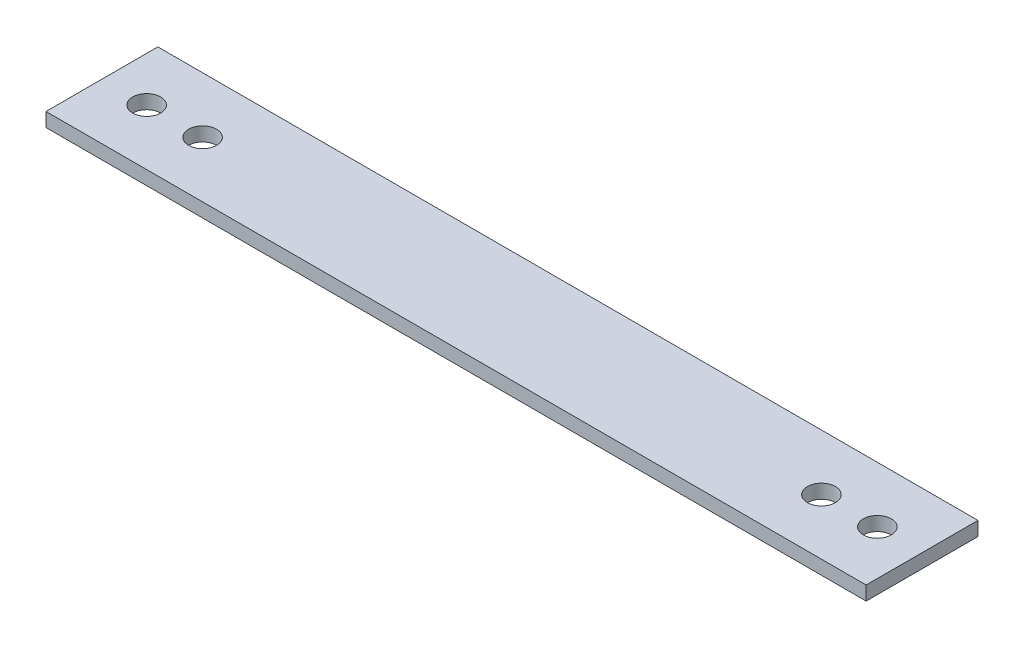
ISO-10303-21;
HEADER;
FILE_DESCRIPTION(('STEP AP214'),'2;1');
FILE_NAME('part.step','',(''),(''),'','','');
FILE_SCHEMA(('AUTOMOTIVE_DESIGN { 1 0 10303 214 1 1 1 1 }'));
ENDSEC;
DATA;
#1=APPLICATION_CONTEXT('core data for automotive mechanical design processes');
#2=APPLICATION_PROTOCOL_DEFINITION('international standard','automotive_design',2000,#1);
#3=PRODUCT_CONTEXT('',#1,'mechanical');
#4=PRODUCT('Part','Part','',(#3));
#5=PRODUCT_RELATED_PRODUCT_CATEGORY('part','',(#4));
#6=PRODUCT_DEFINITION_FORMATION('','',#4);
#7=PRODUCT_DEFINITION_CONTEXT('part definition',#1,'design');
#8=PRODUCT_DEFINITION('design','',#6,#7);
#9=PRODUCT_DEFINITION_SHAPE('','',#8);
#10=(LENGTH_UNIT() NAMED_UNIT(*) SI_UNIT(.MILLI.,.METRE.));
#11=(NAMED_UNIT(*) PLANE_ANGLE_UNIT() SI_UNIT($,.RADIAN.));
#12=(NAMED_UNIT(*) SI_UNIT($,.STERADIAN.) SOLID_ANGLE_UNIT());
#13=UNCERTAINTY_MEASURE_WITH_UNIT(LENGTH_MEASURE(1.E-05),#10,'distance_accuracy_value','');
#14=(GEOMETRIC_REPRESENTATION_CONTEXT(3) GLOBAL_UNCERTAINTY_ASSIGNED_CONTEXT((#13)) GLOBAL_UNIT_ASSIGNED_CONTEXT((#10,
#11,#12)) REPRESENTATION_CONTEXT('',''));
#15=CARTESIAN_POINT('',(0.,0.,0.));
#16=DIRECTION('',(0.,0.,1.));
#17=DIRECTION('',(1.,0.,0.));
#18=AXIS2_PLACEMENT_3D('',#15,#16,#17);
#19=CARTESIAN_POINT('',(0.,4.7625,0.));
#20=DIRECTION('',(0.,-1.,0.));
#21=DIRECTION('',(0.,0.,-1.));
#22=AXIS2_PLACEMENT_3D('',#19,#20,#21);
#23=PLANE('',#22);
#24=DIRECTION('',(0.,0.,-1.));
#25=VECTOR('',#24,1.);
#26=CARTESIAN_POINT('',(139.7,4.7625,19.05));
#27=LINE('',#26,#25);
#28=CARTESIAN_POINT('',(139.7,4.7625,19.05));
#29=VERTEX_POINT('',#28);
#30=CARTESIAN_POINT('',(139.7,4.7625,-19.05));
#31=VERTEX_POINT('',#30);
#32=EDGE_CURVE('E96',#29,#31,#27,.T.);
#33=ORIENTED_EDGE('',*,*,#32,.T.);
#34=DIRECTION('',(-1.,0.,0.));
#35=VECTOR('',#34,1.);
#36=CARTESIAN_POINT('',(-139.7,4.7625,-19.05));
#37=LINE('',#36,#35);
#38=CARTESIAN_POINT('',(-139.7,4.7625,-19.05));
#39=VERTEX_POINT('',#38);
#40=EDGE_CURVE('E91',#31,#39,#37,.T.);
#41=ORIENTED_EDGE('',*,*,#40,.T.);
#42=DIRECTION('',(0.,0.,1.));
#43=VECTOR('',#42,1.);
#44=CARTESIAN_POINT('',(-139.7,4.7625,19.05));
#45=LINE('',#44,#43);
#46=CARTESIAN_POINT('',(-139.7,4.7625,19.05));
#47=VERTEX_POINT('',#46);
#48=EDGE_CURVE('E94',#39,#47,#45,.T.);
#49=ORIENTED_EDGE('',*,*,#48,.T.);
#50=DIRECTION('',(1.,0.,0.));
#51=VECTOR('',#50,1.);
#52=CARTESIAN_POINT('',(-139.7,4.7625,19.05));
#53=LINE('',#52,#51);
#54=EDGE_CURVE('E61',#47,#29,#53,.T.);
#55=ORIENTED_EDGE('',*,*,#54,.T.);
#56=EDGE_LOOP('',(#33,#41,#49,#55));
#57=FACE_BOUND('',#56,.T.);
#58=CARTESIAN_POINT('',(-124.46,4.7625,0.));
#59=DIRECTION('',(0.,1.,0.));
#60=DIRECTION('',(0.,0.,1.));
#61=AXIS2_PLACEMENT_3D('',#58,#59,#60);
#62=CIRCLE('',#61,4.7625);
#63=CARTESIAN_POINT('',(-124.46,4.7625,-4.7625));
#64=VERTEX_POINT('',#63);
#65=EDGE_CURVE('E116',#64,#64,#62,.T.);
#66=ORIENTED_EDGE('',*,*,#65,.F.);
#67=EDGE_LOOP('',(#66));
#68=FACE_BOUND('',#67,.T.);
#69=CARTESIAN_POINT('',(-105.41,4.7625,0.));
#70=DIRECTION('',(0.,1.,0.));
#71=DIRECTION('',(0.,0.,1.));
#72=AXIS2_PLACEMENT_3D('',#69,#70,#71);
#73=CIRCLE('',#72,4.7625);
#74=CARTESIAN_POINT('',(-105.41,4.7625,-4.7625));
#75=VERTEX_POINT('',#74);
#76=EDGE_CURVE('E138',#75,#75,#73,.T.);
#77=ORIENTED_EDGE('',*,*,#76,.F.);
#78=EDGE_LOOP('',(#77));
#79=FACE_BOUND('',#78,.T.);
#80=CARTESIAN_POINT('',(124.46,4.7625,0.));
#81=DIRECTION('',(0.,1.,0.));
#82=DIRECTION('',(0.,0.,-1.));
#83=AXIS2_PLACEMENT_3D('',#80,#81,#82);
#84=CIRCLE('',#83,4.76250000000001);
#85=CARTESIAN_POINT('',(124.46,4.7625,-4.76250000000004));
#86=VERTEX_POINT('',#85);
#87=EDGE_CURVE('E146',#86,#86,#84,.T.);
#88=ORIENTED_EDGE('',*,*,#87,.F.);
#89=EDGE_LOOP('',(#88));
#90=FACE_BOUND('',#89,.T.);
#91=CARTESIAN_POINT('',(105.41,4.7625,0.));
#92=DIRECTION('',(0.,1.,0.));
#93=DIRECTION('',(0.,0.,-1.));
#94=AXIS2_PLACEMENT_3D('',#91,#92,#93);
#95=CIRCLE('',#94,4.7625);
#96=CARTESIAN_POINT('',(105.41,4.7625,-4.76250000000002));
#97=VERTEX_POINT('',#96);
#98=EDGE_CURVE('E154',#97,#97,#95,.T.);
#99=ORIENTED_EDGE('',*,*,#98,.F.);
#100=EDGE_LOOP('',(#99));
#101=FACE_BOUND('',#100,.T.);
#102=ADVANCED_FACE('F43',(#57,#68,#79,#90,#101),#23,.F.);
#103=CARTESIAN_POINT('',(0.,0.,0.));
#104=DIRECTION('',(0.,-1.,0.));
#105=DIRECTION('',(0.,0.,-1.));
#106=AXIS2_PLACEMENT_3D('',#103,#104,#105);
#107=PLANE('',#106);
#108=CARTESIAN_POINT('',(124.46,0.,0.));
#109=DIRECTION('',(0.,1.,0.));
#110=DIRECTION('',(0.,0.,-1.));
#111=AXIS2_PLACEMENT_3D('',#108,#109,#110);
#112=CIRCLE('',#111,4.76250000000001);
#113=CARTESIAN_POINT('',(124.46,0.,-4.76250000000004));
#114=VERTEX_POINT('',#113);
#115=EDGE_CURVE('E150',#114,#114,#112,.T.);
#116=ORIENTED_EDGE('',*,*,#115,.T.);
#117=EDGE_LOOP('',(#116));
#118=FACE_BOUND('',#117,.T.);
#119=CARTESIAN_POINT('',(-124.46,0.,0.));
#120=DIRECTION('',(0.,1.,0.));
#121=DIRECTION('',(0.,0.,1.));
#122=AXIS2_PLACEMENT_3D('',#119,#120,#121);
#123=CIRCLE('',#122,4.7625);
#124=CARTESIAN_POINT('',(-124.46,0.,-4.7625));
#125=VERTEX_POINT('',#124);
#126=EDGE_CURVE('E134',#125,#125,#123,.T.);
#127=ORIENTED_EDGE('',*,*,#126,.T.);
#128=EDGE_LOOP('',(#127));
#129=FACE_BOUND('',#128,.T.);
#130=DIRECTION('',(0.,0.,-1.));
#131=VECTOR('',#130,1.);
#132=CARTESIAN_POINT('',(139.7,0.,19.05));
#133=LINE('',#132,#131);
#134=CARTESIAN_POINT('',(139.7,0.,19.05));
#135=VERTEX_POINT('',#134);
#136=CARTESIAN_POINT('',(139.7,0.,-19.05));
#137=VERTEX_POINT('',#136);
#138=EDGE_CURVE('E112',#135,#137,#133,.T.);
#139=ORIENTED_EDGE('',*,*,#138,.F.);
#140=DIRECTION('',(1.,0.,0.));
#141=VECTOR('',#140,1.);
#142=CARTESIAN_POINT('',(-139.7,0.,19.05));
#143=LINE('',#142,#141);
#144=CARTESIAN_POINT('',(-139.7,0.,19.05));
#145=VERTEX_POINT('',#144);
#146=EDGE_CURVE('E84',#145,#135,#143,.T.);
#147=ORIENTED_EDGE('',*,*,#146,.F.);
#148=DIRECTION('',(0.,0.,1.));
#149=VECTOR('',#148,1.);
#150=CARTESIAN_POINT('',(-139.7,0.,19.05));
#151=LINE('',#150,#149);
#152=CARTESIAN_POINT('',(-139.7,0.,-19.05));
#153=VERTEX_POINT('',#152);
#154=EDGE_CURVE('E78',#153,#145,#151,.T.);
#155=ORIENTED_EDGE('',*,*,#154,.F.);
#156=DIRECTION('',(-1.,0.,0.));
#157=VECTOR('',#156,1.);
#158=CARTESIAN_POINT('',(-139.7,0.,-19.05));
#159=LINE('',#158,#157);
#160=EDGE_CURVE('E101',#137,#153,#159,.T.);
#161=ORIENTED_EDGE('',*,*,#160,.F.);
#162=EDGE_LOOP('',(#139,#147,#155,#161));
#163=FACE_BOUND('',#162,.T.);
#164=CARTESIAN_POINT('',(-105.41,0.,0.));
#165=DIRECTION('',(0.,1.,0.));
#166=DIRECTION('',(0.,0.,1.));
#167=AXIS2_PLACEMENT_3D('',#164,#165,#166);
#168=CIRCLE('',#167,4.7625);
#169=CARTESIAN_POINT('',(-105.41,0.,-4.7625));
#170=VERTEX_POINT('',#169);
#171=EDGE_CURVE('E142',#170,#170,#168,.T.);
#172=ORIENTED_EDGE('',*,*,#171,.T.);
#173=EDGE_LOOP('',(#172));
#174=FACE_BOUND('',#173,.T.);
#175=CARTESIAN_POINT('',(105.41,0.,0.));
#176=DIRECTION('',(0.,1.,0.));
#177=DIRECTION('',(0.,0.,-1.));
#178=AXIS2_PLACEMENT_3D('',#175,#176,#177);
#179=CIRCLE('',#178,4.7625);
#180=CARTESIAN_POINT('',(105.41,0.,-4.76250000000002));
#181=VERTEX_POINT('',#180);
#182=EDGE_CURVE('E158',#181,#181,#179,.T.);
#183=ORIENTED_EDGE('',*,*,#182,.T.);
#184=EDGE_LOOP('',(#183));
#185=FACE_BOUND('',#184,.T.);
#186=ADVANCED_FACE('F129',(#118,#129,#163,#174,#185),#107,.T.);
#187=CARTESIAN_POINT('',(139.7,4.7625,19.05));
#188=DIRECTION('',(-1.,0.,0.));
#189=DIRECTION('',(0.,0.,1.));
#190=AXIS2_PLACEMENT_3D('',#187,#188,#189);
#191=PLANE('',#190);
#192=ORIENTED_EDGE('',*,*,#138,.T.);
#193=DIRECTION('',(0.,-1.,0.));
#194=VECTOR('',#193,1.);
#195=CARTESIAN_POINT('',(139.7,4.7625,-19.05));
#196=LINE('',#195,#194);
#197=EDGE_CURVE('E11',#31,#137,#196,.T.);
#198=ORIENTED_EDGE('',*,*,#197,.F.);
#199=ORIENTED_EDGE('',*,*,#32,.F.);
#200=DIRECTION('',(0.,-1.,0.));
#201=VECTOR('',#200,1.);
#202=CARTESIAN_POINT('',(139.7,4.7625,19.05));
#203=LINE('',#202,#201);
#204=EDGE_CURVE('E108',#29,#135,#203,.T.);
#205=ORIENTED_EDGE('',*,*,#204,.T.);
#206=EDGE_LOOP('',(#192,#198,#199,#205));
#207=FACE_BOUND('',#206,.T.);
#208=ADVANCED_FACE('F45',(#207),#191,.F.);
#209=CARTESIAN_POINT('',(-139.7,4.7625,-19.05));
#210=DIRECTION('',(0.,0.,1.));
#211=DIRECTION('',(1.,0.,0.));
#212=AXIS2_PLACEMENT_3D('',#209,#210,#211);
#213=PLANE('',#212);
#214=ORIENTED_EDGE('',*,*,#160,.T.);
#215=DIRECTION('',(0.,-1.,0.));
#216=VECTOR('',#215,1.);
#217=CARTESIAN_POINT('',(-139.7,4.7625,-19.05));
#218=LINE('',#217,#216);
#219=EDGE_CURVE('E53',#39,#153,#218,.T.);
#220=ORIENTED_EDGE('',*,*,#219,.F.);
#221=ORIENTED_EDGE('',*,*,#40,.F.);
#222=ORIENTED_EDGE('',*,*,#197,.T.);
#223=EDGE_LOOP('',(#214,#220,#221,#222));
#224=FACE_BOUND('',#223,.T.);
#225=ADVANCED_FACE('F100',(#224),#213,.F.);
#226=CARTESIAN_POINT('',(-139.7,4.7625,19.05));
#227=DIRECTION('',(1.,0.,0.));
#228=DIRECTION('',(0.,0.,-1.));
#229=AXIS2_PLACEMENT_3D('',#226,#227,#228);
#230=PLANE('',#229);
#231=ORIENTED_EDGE('',*,*,#154,.T.);
#232=DIRECTION('',(0.,-1.,0.));
#233=VECTOR('',#232,1.);
#234=CARTESIAN_POINT('',(-139.7,4.7625,19.05));
#235=LINE('',#234,#233);
#236=EDGE_CURVE('E103',#47,#145,#235,.T.);
#237=ORIENTED_EDGE('',*,*,#236,.F.);
#238=ORIENTED_EDGE('',*,*,#48,.F.);
#239=ORIENTED_EDGE('',*,*,#219,.T.);
#240=EDGE_LOOP('',(#231,#237,#238,#239));
#241=FACE_BOUND('',#240,.T.);
#242=ADVANCED_FACE('F104',(#241),#230,.F.);
#243=CARTESIAN_POINT('',(-139.7,4.7625,19.05));
#244=DIRECTION('',(0.,0.,-1.));
#245=DIRECTION('',(-1.,0.,0.));
#246=AXIS2_PLACEMENT_3D('',#243,#244,#245);
#247=PLANE('',#246);
#248=ORIENTED_EDGE('',*,*,#146,.T.);
#249=ORIENTED_EDGE('',*,*,#204,.F.);
#250=ORIENTED_EDGE('',*,*,#54,.F.);
#251=ORIENTED_EDGE('',*,*,#236,.T.);
#252=EDGE_LOOP('',(#248,#249,#250,#251));
#253=FACE_BOUND('',#252,.T.);
#254=ADVANCED_FACE('F126',(#253),#247,.F.);
#255=CARTESIAN_POINT('',(-124.46,4.7625,0.));
#256=DIRECTION('',(0.,-1.,0.));
#257=DIRECTION('',(0.,0.,-1.));
#258=AXIS2_PLACEMENT_3D('',#255,#256,#257);
#259=CYLINDRICAL_SURFACE('',#258,4.7625);
#260=CARTESIAN_POINT('',(-124.46,4.7625,-4.7625));
#261=CARTESIAN_POINT('',(-124.46,4.712890625,-4.7625));
#262=CARTESIAN_POINT('',(-124.46,4.66328125,-4.7625));
#263=CARTESIAN_POINT('',(-124.46,4.5640625,-4.7625));
#264=CARTESIAN_POINT('',(-124.46,4.514453125,-4.7625));
#265=CARTESIAN_POINT('',(-124.46,4.415234375,-4.7625));
#266=CARTESIAN_POINT('',(-124.46,4.365625,-4.7625));
#267=CARTESIAN_POINT('',(-124.46,4.26640625,-4.7625));
#268=CARTESIAN_POINT('',(-124.46,4.216796875,-4.7625));
#269=CARTESIAN_POINT('',(-124.46,4.117578125,-4.7625));
#270=CARTESIAN_POINT('',(-124.46,4.06796875,-4.7625));
#271=CARTESIAN_POINT('',(-124.46,3.96875,-4.7625));
#272=CARTESIAN_POINT('',(-124.46,3.919140625,-4.7625));
#273=CARTESIAN_POINT('',(-124.46,3.819921875,-4.7625));
#274=CARTESIAN_POINT('',(-124.46,3.7703125,-4.7625));
#275=CARTESIAN_POINT('',(-124.46,3.67109375,-4.7625));
#276=CARTESIAN_POINT('',(-124.46,3.621484375,-4.7625));
#277=CARTESIAN_POINT('',(-124.46,3.522265625,-4.7625));
#278=CARTESIAN_POINT('',(-124.46,3.47265625,-4.7625));
#279=CARTESIAN_POINT('',(-124.46,3.3734375,-4.7625));
#280=CARTESIAN_POINT('',(-124.46,3.323828125,-4.7625));
#281=CARTESIAN_POINT('',(-124.46,3.224609375,-4.7625));
#282=CARTESIAN_POINT('',(-124.46,3.175,-4.7625));
#283=CARTESIAN_POINT('',(-124.46,3.07578125,-4.7625));
#284=CARTESIAN_POINT('',(-124.46,3.026171875,-4.7625));
#285=CARTESIAN_POINT('',(-124.46,2.926953125,-4.7625));
#286=CARTESIAN_POINT('',(-124.46,2.87734375,-4.7625));
#287=CARTESIAN_POINT('',(-124.46,2.778125,-4.7625));
#288=CARTESIAN_POINT('',(-124.46,2.728515625,-4.7625));
#289=CARTESIAN_POINT('',(-124.46,2.629296875,-4.7625));
#290=CARTESIAN_POINT('',(-124.46,2.5796875,-4.7625));
#291=CARTESIAN_POINT('',(-124.46,2.48046875,-4.7625));
#292=CARTESIAN_POINT('',(-124.46,2.430859375,-4.7625));
#293=CARTESIAN_POINT('',(-124.46,2.331640625,-4.7625));
#294=CARTESIAN_POINT('',(-124.46,2.28203125,-4.7625));
#295=CARTESIAN_POINT('',(-124.46,2.1828125,-4.7625));
#296=CARTESIAN_POINT('',(-124.46,2.133203125,-4.7625));
#297=CARTESIAN_POINT('',(-124.46,2.033984375,-4.7625));
#298=CARTESIAN_POINT('',(-124.46,1.984375,-4.7625));
#299=CARTESIAN_POINT('',(-124.46,1.88515625,-4.7625));
#300=CARTESIAN_POINT('',(-124.46,1.835546875,-4.7625));
#301=CARTESIAN_POINT('',(-124.46,1.736328125,-4.7625));
#302=CARTESIAN_POINT('',(-124.46,1.68671875,-4.7625));
#303=CARTESIAN_POINT('',(-124.46,1.5875,-4.7625));
#304=CARTESIAN_POINT('',(-124.46,1.537890625,-4.7625));
#305=CARTESIAN_POINT('',(-124.46,1.438671875,-4.7625));
#306=CARTESIAN_POINT('',(-124.46,1.3890625,-4.7625));
#307=CARTESIAN_POINT('',(-124.46,1.28984375,-4.7625));
#308=CARTESIAN_POINT('',(-124.46,1.240234375,-4.7625));
#309=CARTESIAN_POINT('',(-124.46,1.141015625,-4.7625));
#310=CARTESIAN_POINT('',(-124.46,1.09140625,-4.7625));
#311=CARTESIAN_POINT('',(-124.46,0.992187499999999,-4.7625));
#312=CARTESIAN_POINT('',(-124.46,0.942578124999999,-4.7625));
#313=CARTESIAN_POINT('',(-124.46,0.843359375,-4.7625));
#314=CARTESIAN_POINT('',(-124.46,0.79375,-4.7625));
#315=CARTESIAN_POINT('',(-124.46,0.69453125,-4.7625));
#316=CARTESIAN_POINT('',(-124.46,0.644921875,-4.7625));
#317=CARTESIAN_POINT('',(-124.46,0.545703125,-4.7625));
#318=CARTESIAN_POINT('',(-124.46,0.49609375,-4.7625));
#319=CARTESIAN_POINT('',(-124.46,0.396875,-4.7625));
#320=CARTESIAN_POINT('',(-124.46,0.347265625,-4.7625));
#321=CARTESIAN_POINT('',(-124.46,0.248046875,-4.7625));
#322=CARTESIAN_POINT('',(-124.46,0.1984375,-4.7625));
#323=CARTESIAN_POINT('',(-124.46,0.09921875,-4.7625));
#324=CARTESIAN_POINT('',(-124.46,0.049609375,-4.7625));
#325=CARTESIAN_POINT('',(-124.46,0.,-4.7625));
#326=B_SPLINE_CURVE_WITH_KNOTS('',3,(#260,#261,#262,#263,#264,#265,#266,#267,#268,#269,#270,
#271,#272,#273,#274,#275,#276,#277,#278,#279,#280,#281,#282,#283,#284,#285,#286,#287,#288,#289,
#290,#291,#292,#293,#294,#295,#296,#297,#298,#299,#300,#301,#302,#303,#304,#305,#306,#307,#308,
#309,#310,#311,#312,#313,#314,#315,#316,#317,#318,#319,#320,#321,#322,#323,#324,#325),
.UNSPECIFIED.,.F.,.F.,(4,2,2,2,2,2,2,2,2,2,2,2,2,2,2,2,2,2,2,2,2,2,2,2,2,2,2,2,2,2,2,2,4),(0.,
0.148828125,0.29765625,0.446484375,0.5953125,0.744140625,0.892968750000001,1.041796875,1.190625,
1.339453125,1.48828125,1.637109375,1.7859375,1.934765625,2.08359375,2.232421875,2.38125,
2.530078125,2.67890625,2.827734375,2.9765625,3.125390625,3.27421875,3.423046875,3.571875,
3.720703125,3.86953125,4.018359375,4.1671875,4.316015625,4.46484375,4.613671875,4.7625),.UNSPECIFIED.);
#327=EDGE_CURVE('BSEAM177',#64,#125,#326,.T.);
#328=ORIENTED_EDGE('',*,*,#65,.T.);
#329=ORIENTED_EDGE('',*,*,#126,.F.);
#330=ORIENTED_EDGE('',*,*,#327,.T.);
#331=ORIENTED_EDGE('',*,*,#327,.F.);
#332=EDGE_LOOP('',(#328,#330,#329,#331));
#333=FACE_BOUND('',#332,.T.);
#334=ADVANCED_FACE('F177',(#333),#259,.F.);
#335=CARTESIAN_POINT('',(-105.41,4.7625,0.));
#336=DIRECTION('',(0.,-1.,0.));
#337=DIRECTION('',(0.,0.,-1.));
#338=AXIS2_PLACEMENT_3D('',#335,#336,#337);
#339=CYLINDRICAL_SURFACE('',#338,4.7625);
#340=CARTESIAN_POINT('',(-105.41,4.7625,-4.7625));
#341=CARTESIAN_POINT('',(-105.41,4.712890625,-4.7625));
#342=CARTESIAN_POINT('',(-105.41,4.66328125,-4.7625));
#343=CARTESIAN_POINT('',(-105.41,4.5640625,-4.7625));
#344=CARTESIAN_POINT('',(-105.41,4.514453125,-4.7625));
#345=CARTESIAN_POINT('',(-105.41,4.415234375,-4.7625));
#346=CARTESIAN_POINT('',(-105.41,4.365625,-4.7625));
#347=CARTESIAN_POINT('',(-105.41,4.26640625,-4.7625));
#348=CARTESIAN_POINT('',(-105.41,4.216796875,-4.7625));
#349=CARTESIAN_POINT('',(-105.41,4.117578125,-4.7625));
#350=CARTESIAN_POINT('',(-105.41,4.06796875,-4.7625));
#351=CARTESIAN_POINT('',(-105.41,3.96875,-4.7625));
#352=CARTESIAN_POINT('',(-105.41,3.919140625,-4.7625));
#353=CARTESIAN_POINT('',(-105.41,3.819921875,-4.7625));
#354=CARTESIAN_POINT('',(-105.41,3.7703125,-4.7625));
#355=CARTESIAN_POINT('',(-105.41,3.67109375,-4.7625));
#356=CARTESIAN_POINT('',(-105.41,3.621484375,-4.7625));
#357=CARTESIAN_POINT('',(-105.41,3.522265625,-4.7625));
#358=CARTESIAN_POINT('',(-105.41,3.47265625,-4.7625));
#359=CARTESIAN_POINT('',(-105.41,3.3734375,-4.7625));
#360=CARTESIAN_POINT('',(-105.41,3.323828125,-4.7625));
#361=CARTESIAN_POINT('',(-105.41,3.224609375,-4.7625));
#362=CARTESIAN_POINT('',(-105.41,3.175,-4.7625));
#363=CARTESIAN_POINT('',(-105.41,3.07578125,-4.7625));
#364=CARTESIAN_POINT('',(-105.41,3.026171875,-4.7625));
#365=CARTESIAN_POINT('',(-105.41,2.926953125,-4.7625));
#366=CARTESIAN_POINT('',(-105.41,2.87734375,-4.7625));
#367=CARTESIAN_POINT('',(-105.41,2.778125,-4.7625));
#368=CARTESIAN_POINT('',(-105.41,2.728515625,-4.7625));
#369=CARTESIAN_POINT('',(-105.41,2.629296875,-4.7625));
#370=CARTESIAN_POINT('',(-105.41,2.5796875,-4.7625));
#371=CARTESIAN_POINT('',(-105.41,2.48046875,-4.7625));
#372=CARTESIAN_POINT('',(-105.41,2.430859375,-4.7625));
#373=CARTESIAN_POINT('',(-105.41,2.331640625,-4.7625));
#374=CARTESIAN_POINT('',(-105.41,2.28203125,-4.7625));
#375=CARTESIAN_POINT('',(-105.41,2.1828125,-4.7625));
#376=CARTESIAN_POINT('',(-105.41,2.133203125,-4.7625));
#377=CARTESIAN_POINT('',(-105.41,2.033984375,-4.7625));
#378=CARTESIAN_POINT('',(-105.41,1.984375,-4.7625));
#379=CARTESIAN_POINT('',(-105.41,1.88515625,-4.7625));
#380=CARTESIAN_POINT('',(-105.41,1.835546875,-4.7625));
#381=CARTESIAN_POINT('',(-105.41,1.736328125,-4.7625));
#382=CARTESIAN_POINT('',(-105.41,1.68671875,-4.7625));
#383=CARTESIAN_POINT('',(-105.41,1.5875,-4.7625));
#384=CARTESIAN_POINT('',(-105.41,1.537890625,-4.7625));
#385=CARTESIAN_POINT('',(-105.41,1.438671875,-4.7625));
#386=CARTESIAN_POINT('',(-105.41,1.3890625,-4.7625));
#387=CARTESIAN_POINT('',(-105.41,1.28984375,-4.7625));
#388=CARTESIAN_POINT('',(-105.41,1.240234375,-4.7625));
#389=CARTESIAN_POINT('',(-105.41,1.141015625,-4.7625));
#390=CARTESIAN_POINT('',(-105.41,1.09140625,-4.7625));
#391=CARTESIAN_POINT('',(-105.41,0.992187499999999,-4.7625));
#392=CARTESIAN_POINT('',(-105.41,0.942578124999999,-4.7625));
#393=CARTESIAN_POINT('',(-105.41,0.843359375,-4.7625));
#394=CARTESIAN_POINT('',(-105.41,0.79375,-4.7625));
#395=CARTESIAN_POINT('',(-105.41,0.69453125,-4.7625));
#396=CARTESIAN_POINT('',(-105.41,0.644921875,-4.7625));
#397=CARTESIAN_POINT('',(-105.41,0.545703125,-4.7625));
#398=CARTESIAN_POINT('',(-105.41,0.49609375,-4.7625));
#399=CARTESIAN_POINT('',(-105.41,0.396875,-4.7625));
#400=CARTESIAN_POINT('',(-105.41,0.347265625,-4.7625));
#401=CARTESIAN_POINT('',(-105.41,0.248046875,-4.7625));
#402=CARTESIAN_POINT('',(-105.41,0.1984375,-4.7625));
#403=CARTESIAN_POINT('',(-105.41,0.09921875,-4.7625));
#404=CARTESIAN_POINT('',(-105.41,0.049609375,-4.7625));
#405=CARTESIAN_POINT('',(-105.41,0.,-4.7625));
#406=B_SPLINE_CURVE_WITH_KNOTS('',3,(#340,#341,#342,#343,#344,#345,#346,#347,#348,#349,#350,
#351,#352,#353,#354,#355,#356,#357,#358,#359,#360,#361,#362,#363,#364,#365,#366,#367,#368,#369,
#370,#371,#372,#373,#374,#375,#376,#377,#378,#379,#380,#381,#382,#383,#384,#385,#386,#387,#388,
#389,#390,#391,#392,#393,#394,#395,#396,#397,#398,#399,#400,#401,#402,#403,#404,#405),
.UNSPECIFIED.,.F.,.F.,(4,2,2,2,2,2,2,2,2,2,2,2,2,2,2,2,2,2,2,2,2,2,2,2,2,2,2,2,2,2,2,2,4),(0.,
0.148828125,0.29765625,0.446484375,0.5953125,0.744140625,0.892968750000001,1.041796875,1.190625,
1.339453125,1.48828125,1.637109375,1.7859375,1.934765625,2.08359375,2.232421875,2.38125,
2.530078125,2.67890625,2.827734375,2.9765625,3.125390625,3.27421875,3.423046875,3.571875,
3.720703125,3.86953125,4.018359375,4.1671875,4.316015625,4.46484375,4.613671875,4.7625),.UNSPECIFIED.);
#407=EDGE_CURVE('BSEAM231',#75,#170,#406,.T.);
#408=ORIENTED_EDGE('',*,*,#76,.T.);
#409=ORIENTED_EDGE('',*,*,#171,.F.);
#410=ORIENTED_EDGE('',*,*,#407,.T.);
#411=ORIENTED_EDGE('',*,*,#407,.F.);
#412=EDGE_LOOP('',(#408,#410,#409,#411));
#413=FACE_BOUND('',#412,.T.);
#414=ADVANCED_FACE('F231',(#413),#339,.F.);
#415=CARTESIAN_POINT('',(124.46,4.7625,0.));
#416=DIRECTION('',(0.,-1.,0.));
#417=DIRECTION('',(0.,0.,-1.));
#418=AXIS2_PLACEMENT_3D('',#415,#416,#417);
#419=CYLINDRICAL_SURFACE('',#418,4.76250000000001);
#420=CARTESIAN_POINT('',(124.46,4.7625,-4.76250000000004));
#421=CARTESIAN_POINT('',(124.46,4.712890625,-4.76250000000004));
#422=CARTESIAN_POINT('',(124.46,4.66328125,-4.76250000000004));
#423=CARTESIAN_POINT('',(124.46,4.5640625,-4.76250000000004));
#424=CARTESIAN_POINT('',(124.46,4.514453125,-4.76250000000004));
#425=CARTESIAN_POINT('',(124.46,4.415234375,-4.76250000000004));
#426=CARTESIAN_POINT('',(124.46,4.365625,-4.76250000000004));
#427=CARTESIAN_POINT('',(124.46,4.26640625,-4.76250000000004));
#428=CARTESIAN_POINT('',(124.46,4.216796875,-4.76250000000004));
#429=CARTESIAN_POINT('',(124.46,4.117578125,-4.76250000000004));
#430=CARTESIAN_POINT('',(124.46,4.06796875,-4.76250000000004));
#431=CARTESIAN_POINT('',(124.46,3.96875,-4.76250000000004));
#432=CARTESIAN_POINT('',(124.46,3.919140625,-4.76250000000004));
#433=CARTESIAN_POINT('',(124.46,3.819921875,-4.76250000000004));
#434=CARTESIAN_POINT('',(124.46,3.7703125,-4.76250000000004));
#435=CARTESIAN_POINT('',(124.46,3.67109375,-4.76250000000004));
#436=CARTESIAN_POINT('',(124.46,3.621484375,-4.76250000000004));
#437=CARTESIAN_POINT('',(124.46,3.522265625,-4.76250000000004));
#438=CARTESIAN_POINT('',(124.46,3.47265625,-4.76250000000004));
#439=CARTESIAN_POINT('',(124.46,3.3734375,-4.76250000000004));
#440=CARTESIAN_POINT('',(124.46,3.323828125,-4.76250000000004));
#441=CARTESIAN_POINT('',(124.46,3.224609375,-4.76250000000004));
#442=CARTESIAN_POINT('',(124.46,3.175,-4.76250000000004));
#443=CARTESIAN_POINT('',(124.46,3.07578125,-4.76250000000004));
#444=CARTESIAN_POINT('',(124.46,3.026171875,-4.76250000000004));
#445=CARTESIAN_POINT('',(124.46,2.926953125,-4.76250000000004));
#446=CARTESIAN_POINT('',(124.46,2.87734375,-4.76250000000004));
#447=CARTESIAN_POINT('',(124.46,2.778125,-4.76250000000004));
#448=CARTESIAN_POINT('',(124.46,2.728515625,-4.76250000000004));
#449=CARTESIAN_POINT('',(124.46,2.629296875,-4.76250000000004));
#450=CARTESIAN_POINT('',(124.46,2.5796875,-4.76250000000004));
#451=CARTESIAN_POINT('',(124.46,2.48046875,-4.76250000000004));
#452=CARTESIAN_POINT('',(124.46,2.430859375,-4.76250000000004));
#453=CARTESIAN_POINT('',(124.46,2.331640625,-4.76250000000004));
#454=CARTESIAN_POINT('',(124.46,2.28203125,-4.76250000000004));
#455=CARTESIAN_POINT('',(124.46,2.1828125,-4.76250000000004));
#456=CARTESIAN_POINT('',(124.46,2.133203125,-4.76250000000004));
#457=CARTESIAN_POINT('',(124.46,2.033984375,-4.76250000000004));
#458=CARTESIAN_POINT('',(124.46,1.984375,-4.76250000000004));
#459=CARTESIAN_POINT('',(124.46,1.88515625,-4.76250000000004));
#460=CARTESIAN_POINT('',(124.46,1.835546875,-4.76250000000004));
#461=CARTESIAN_POINT('',(124.46,1.736328125,-4.76250000000004));
#462=CARTESIAN_POINT('',(124.46,1.68671875,-4.76250000000004));
#463=CARTESIAN_POINT('',(124.46,1.5875,-4.76250000000004));
#464=CARTESIAN_POINT('',(124.46,1.537890625,-4.76250000000004));
#465=CARTESIAN_POINT('',(124.46,1.438671875,-4.76250000000004));
#466=CARTESIAN_POINT('',(124.46,1.3890625,-4.76250000000004));
#467=CARTESIAN_POINT('',(124.46,1.28984375,-4.76250000000004));
#468=CARTESIAN_POINT('',(124.46,1.240234375,-4.76250000000004));
#469=CARTESIAN_POINT('',(124.46,1.141015625,-4.76250000000004));
#470=CARTESIAN_POINT('',(124.46,1.09140625,-4.76250000000004));
#471=CARTESIAN_POINT('',(124.46,0.992187499999999,-4.76250000000004));
#472=CARTESIAN_POINT('',(124.46,0.942578124999999,-4.76250000000004));
#473=CARTESIAN_POINT('',(124.46,0.843359375,-4.76250000000004));
#474=CARTESIAN_POINT('',(124.46,0.79375,-4.76250000000004));
#475=CARTESIAN_POINT('',(124.46,0.69453125,-4.76250000000004));
#476=CARTESIAN_POINT('',(124.46,0.644921875,-4.76250000000004));
#477=CARTESIAN_POINT('',(124.46,0.545703125,-4.76250000000004));
#478=CARTESIAN_POINT('',(124.46,0.49609375,-4.76250000000004));
#479=CARTESIAN_POINT('',(124.46,0.396875,-4.76250000000004));
#480=CARTESIAN_POINT('',(124.46,0.347265625,-4.76250000000004));
#481=CARTESIAN_POINT('',(124.46,0.248046875,-4.76250000000004));
#482=CARTESIAN_POINT('',(124.46,0.1984375,-4.76250000000004));
#483=CARTESIAN_POINT('',(124.46,0.09921875,-4.76250000000004));
#484=CARTESIAN_POINT('',(124.46,0.049609375,-4.76250000000004));
#485=CARTESIAN_POINT('',(124.46,0.,-4.76250000000004));
#486=B_SPLINE_CURVE_WITH_KNOTS('',3,(#420,#421,#422,#423,#424,#425,#426,#427,#428,#429,#430,
#431,#432,#433,#434,#435,#436,#437,#438,#439,#440,#441,#442,#443,#444,#445,#446,#447,#448,#449,
#450,#451,#452,#453,#454,#455,#456,#457,#458,#459,#460,#461,#462,#463,#464,#465,#466,#467,#468,
#469,#470,#471,#472,#473,#474,#475,#476,#477,#478,#479,#480,#481,#482,#483,#484,#485),
.UNSPECIFIED.,.F.,.F.,(4,2,2,2,2,2,2,2,2,2,2,2,2,2,2,2,2,2,2,2,2,2,2,2,2,2,2,2,2,2,2,2,4),(0.,
0.148828125,0.29765625,0.446484375,0.5953125,0.744140625,0.892968750000001,1.041796875,1.190625,
1.339453125,1.48828125,1.637109375,1.7859375,1.934765625,2.08359375,2.232421875,2.38125,
2.530078125,2.67890625,2.827734375,2.9765625,3.125390625,3.27421875,3.423046875,3.571875,
3.720703125,3.86953125,4.018359375,4.1671875,4.316015625,4.46484375,4.613671875,4.7625),.UNSPECIFIED.);
#487=EDGE_CURVE('BSEAM240',#86,#114,#486,.T.);
#488=ORIENTED_EDGE('',*,*,#87,.T.);
#489=ORIENTED_EDGE('',*,*,#115,.F.);
#490=ORIENTED_EDGE('',*,*,#487,.T.);
#491=ORIENTED_EDGE('',*,*,#487,.F.);
#492=EDGE_LOOP('',(#488,#490,#489,#491));
#493=FACE_BOUND('',#492,.T.);
#494=ADVANCED_FACE('F240',(#493),#419,.F.);
#495=CARTESIAN_POINT('',(105.41,4.7625,0.));
#496=DIRECTION('',(0.,-1.,0.));
#497=DIRECTION('',(0.,0.,-1.));
#498=AXIS2_PLACEMENT_3D('',#495,#496,#497);
#499=CYLINDRICAL_SURFACE('',#498,4.7625);
#500=CARTESIAN_POINT('',(105.41,4.7625,-4.76250000000002));
#501=CARTESIAN_POINT('',(105.41,4.712890625,-4.76250000000002));
#502=CARTESIAN_POINT('',(105.41,4.66328125,-4.76250000000002));
#503=CARTESIAN_POINT('',(105.41,4.5640625,-4.76250000000002));
#504=CARTESIAN_POINT('',(105.41,4.514453125,-4.76250000000002));
#505=CARTESIAN_POINT('',(105.41,4.415234375,-4.76250000000002));
#506=CARTESIAN_POINT('',(105.41,4.365625,-4.76250000000002));
#507=CARTESIAN_POINT('',(105.41,4.26640625,-4.76250000000002));
#508=CARTESIAN_POINT('',(105.41,4.216796875,-4.76250000000002));
#509=CARTESIAN_POINT('',(105.41,4.117578125,-4.76250000000002));
#510=CARTESIAN_POINT('',(105.41,4.06796875,-4.76250000000002));
#511=CARTESIAN_POINT('',(105.41,3.96875,-4.76250000000002));
#512=CARTESIAN_POINT('',(105.41,3.919140625,-4.76250000000002));
#513=CARTESIAN_POINT('',(105.41,3.819921875,-4.76250000000002));
#514=CARTESIAN_POINT('',(105.41,3.7703125,-4.76250000000002));
#515=CARTESIAN_POINT('',(105.41,3.67109375,-4.76250000000002));
#516=CARTESIAN_POINT('',(105.41,3.621484375,-4.76250000000002));
#517=CARTESIAN_POINT('',(105.41,3.522265625,-4.76250000000002));
#518=CARTESIAN_POINT('',(105.41,3.47265625,-4.76250000000002));
#519=CARTESIAN_POINT('',(105.41,3.3734375,-4.76250000000002));
#520=CARTESIAN_POINT('',(105.41,3.323828125,-4.76250000000002));
#521=CARTESIAN_POINT('',(105.41,3.224609375,-4.76250000000002));
#522=CARTESIAN_POINT('',(105.41,3.175,-4.76250000000002));
#523=CARTESIAN_POINT('',(105.41,3.07578125,-4.76250000000002));
#524=CARTESIAN_POINT('',(105.41,3.026171875,-4.76250000000002));
#525=CARTESIAN_POINT('',(105.41,2.926953125,-4.76250000000002));
#526=CARTESIAN_POINT('',(105.41,2.87734375,-4.76250000000002));
#527=CARTESIAN_POINT('',(105.41,2.778125,-4.76250000000002));
#528=CARTESIAN_POINT('',(105.41,2.728515625,-4.76250000000002));
#529=CARTESIAN_POINT('',(105.41,2.629296875,-4.76250000000002));
#530=CARTESIAN_POINT('',(105.41,2.5796875,-4.76250000000002));
#531=CARTESIAN_POINT('',(105.41,2.48046875,-4.76250000000002));
#532=CARTESIAN_POINT('',(105.41,2.430859375,-4.76250000000002));
#533=CARTESIAN_POINT('',(105.41,2.331640625,-4.76250000000002));
#534=CARTESIAN_POINT('',(105.41,2.28203125,-4.76250000000002));
#535=CARTESIAN_POINT('',(105.41,2.1828125,-4.76250000000002));
#536=CARTESIAN_POINT('',(105.41,2.133203125,-4.76250000000002));
#537=CARTESIAN_POINT('',(105.41,2.033984375,-4.76250000000002));
#538=CARTESIAN_POINT('',(105.41,1.984375,-4.76250000000002));
#539=CARTESIAN_POINT('',(105.41,1.88515625,-4.76250000000002));
#540=CARTESIAN_POINT('',(105.41,1.835546875,-4.76250000000002));
#541=CARTESIAN_POINT('',(105.41,1.736328125,-4.76250000000002));
#542=CARTESIAN_POINT('',(105.41,1.68671875,-4.76250000000002));
#543=CARTESIAN_POINT('',(105.41,1.5875,-4.76250000000002));
#544=CARTESIAN_POINT('',(105.41,1.537890625,-4.76250000000002));
#545=CARTESIAN_POINT('',(105.41,1.438671875,-4.76250000000002));
#546=CARTESIAN_POINT('',(105.41,1.3890625,-4.76250000000002));
#547=CARTESIAN_POINT('',(105.41,1.28984375,-4.76250000000002));
#548=CARTESIAN_POINT('',(105.41,1.240234375,-4.76250000000002));
#549=CARTESIAN_POINT('',(105.41,1.141015625,-4.76250000000002));
#550=CARTESIAN_POINT('',(105.41,1.09140625,-4.76250000000002));
#551=CARTESIAN_POINT('',(105.41,0.992187499999999,-4.76250000000002));
#552=CARTESIAN_POINT('',(105.41,0.942578124999999,-4.76250000000002));
#553=CARTESIAN_POINT('',(105.41,0.843359375,-4.76250000000002));
#554=CARTESIAN_POINT('',(105.41,0.79375,-4.76250000000002));
#555=CARTESIAN_POINT('',(105.41,0.69453125,-4.76250000000002));
#556=CARTESIAN_POINT('',(105.41,0.644921875,-4.76250000000002));
#557=CARTESIAN_POINT('',(105.41,0.545703125,-4.76250000000002));
#558=CARTESIAN_POINT('',(105.41,0.49609375,-4.76250000000002));
#559=CARTESIAN_POINT('',(105.41,0.396875,-4.76250000000002));
#560=CARTESIAN_POINT('',(105.41,0.347265625,-4.76250000000002));
#561=CARTESIAN_POINT('',(105.41,0.248046875,-4.76250000000002));
#562=CARTESIAN_POINT('',(105.41,0.1984375,-4.76250000000002));
#563=CARTESIAN_POINT('',(105.41,0.09921875,-4.76250000000002));
#564=CARTESIAN_POINT('',(105.41,0.049609375,-4.76250000000002));
#565=CARTESIAN_POINT('',(105.41,0.,-4.76250000000002));
#566=B_SPLINE_CURVE_WITH_KNOTS('',3,(#500,#501,#502,#503,#504,#505,#506,#507,#508,#509,#510,
#511,#512,#513,#514,#515,#516,#517,#518,#519,#520,#521,#522,#523,#524,#525,#526,#527,#528,#529,
#530,#531,#532,#533,#534,#535,#536,#537,#538,#539,#540,#541,#542,#543,#544,#545,#546,#547,#548,
#549,#550,#551,#552,#553,#554,#555,#556,#557,#558,#559,#560,#561,#562,#563,#564,#565),
.UNSPECIFIED.,.F.,.F.,(4,2,2,2,2,2,2,2,2,2,2,2,2,2,2,2,2,2,2,2,2,2,2,2,2,2,2,2,2,2,2,2,4),(0.,
0.148828125,0.29765625,0.446484375,0.5953125,0.744140625,0.892968750000001,1.041796875,1.190625,
1.339453125,1.48828125,1.637109375,1.7859375,1.934765625,2.08359375,2.232421875,2.38125,
2.530078125,2.67890625,2.827734375,2.9765625,3.125390625,3.27421875,3.423046875,3.571875,
3.720703125,3.86953125,4.018359375,4.1671875,4.316015625,4.46484375,4.613671875,4.7625),.UNSPECIFIED.);
#567=EDGE_CURVE('BSEAM166',#97,#181,#566,.T.);
#568=ORIENTED_EDGE('',*,*,#98,.T.);
#569=ORIENTED_EDGE('',*,*,#182,.F.);
#570=ORIENTED_EDGE('',*,*,#567,.T.);
#571=ORIENTED_EDGE('',*,*,#567,.F.);
#572=EDGE_LOOP('',(#568,#570,#569,#571));
#573=FACE_BOUND('',#572,.T.);
#574=ADVANCED_FACE('F166',(#573),#499,.F.);
#575=CLOSED_SHELL('',(#102,#186,#208,#225,#242,#254,#334,#414,#494,#574));
#576=MANIFOLD_SOLID_BREP('B2',#575);
#577=ADVANCED_BREP_SHAPE_REPRESENTATION('',(#18,#576),#14);
#578=SHAPE_DEFINITION_REPRESENTATION(#9,#577);
ENDSEC;
END-ISO-10303-21;
